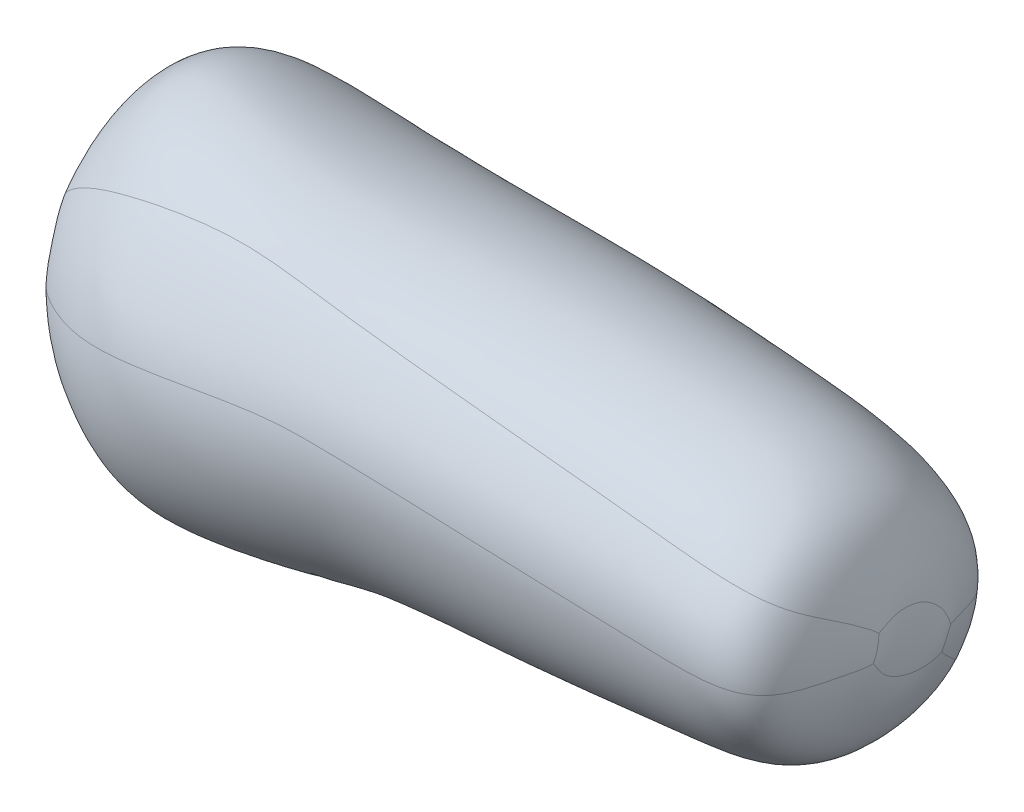
ISO-10303-21;
HEADER;
FILE_DESCRIPTION(('STEP AP214'),'2;1');
FILE_NAME('part.step','',(''),(''),'','','');
FILE_SCHEMA(('AUTOMOTIVE_DESIGN { 1 0 10303 214 1 1 1 1 }'));
ENDSEC;
DATA;
#1=APPLICATION_CONTEXT('core data for automotive mechanical design processes');
#2=APPLICATION_PROTOCOL_DEFINITION('international standard','automotive_design',2000,#1);
#3=PRODUCT_CONTEXT('',#1,'mechanical');
#4=PRODUCT('Part','Part','',(#3));
#5=PRODUCT_RELATED_PRODUCT_CATEGORY('part','',(#4));
#6=PRODUCT_DEFINITION_FORMATION('','',#4);
#7=PRODUCT_DEFINITION_CONTEXT('part definition',#1,'design');
#8=PRODUCT_DEFINITION('design','',#6,#7);
#9=PRODUCT_DEFINITION_SHAPE('','',#8);
#10=(LENGTH_UNIT() NAMED_UNIT(*) SI_UNIT(.MILLI.,.METRE.));
#11=(NAMED_UNIT(*) PLANE_ANGLE_UNIT() SI_UNIT($,.RADIAN.));
#12=(NAMED_UNIT(*) SI_UNIT($,.STERADIAN.) SOLID_ANGLE_UNIT());
#13=UNCERTAINTY_MEASURE_WITH_UNIT(LENGTH_MEASURE(1.E-05),#10,'distance_accuracy_value','');
#14=(GEOMETRIC_REPRESENTATION_CONTEXT(3) GLOBAL_UNCERTAINTY_ASSIGNED_CONTEXT((#13)) GLOBAL_UNIT_ASSIGNED_CONTEXT((#10,
#11,#12)) REPRESENTATION_CONTEXT('',''));
#15=CARTESIAN_POINT('',(0.,0.,0.));
#16=DIRECTION('',(0.,0.,1.));
#17=DIRECTION('',(1.,0.,0.));
#18=AXIS2_PLACEMENT_3D('',#15,#16,#17);
#19=CARTESIAN_POINT('',(701.316047322813,1293.10941921078,-66.2995340034176));
#20=CARTESIAN_POINT('',(701.628375069877,1293.05524359598,-65.9005244747878));
#21=CARTESIAN_POINT('',(703.004654212534,1293.39927603994,-64.8375145417086));
#22=CARTESIAN_POINT('',(706.461888959536,1294.08887285057,-63.359893291705));
#23=CARTESIAN_POINT('',(712.846286632086,1294.47587337821,-64.5137822013995));
#24=CARTESIAN_POINT('',(715.279997034956,1294.04076977927,-64.9688239503356));
#25=CARTESIAN_POINT('',(719.258582003739,1293.43763332773,-65.4507083814109));
#26=CARTESIAN_POINT('',(723.565529320816,1292.80851572084,-65.8782055415214));
#27=CARTESIAN_POINT('',(728.772514788473,1292.22174258743,-66.3144557366205));
#28=CARTESIAN_POINT('',(732.617700847715,1291.85217458737,-66.5115836179016));
#29=CARTESIAN_POINT('',(734.023358130966,1291.51382589544,-67.8653354286268));
#30=CARTESIAN_POINT('',(734.498262195295,1291.38660033271,-70.3148640784867));
#31=CARTESIAN_POINT('',(734.711410390191,1291.30981852722,-71.5943033904152));
#32=CARTESIAN_POINT('',(734.731732336491,1291.35433353155,-71.8669933657349));
#33=CARTESIAN_POINT('',(701.259255735179,1292.62990301695,-66.3707951001111));
#34=CARTESIAN_POINT('',(701.827119641701,1292.0420355935,-65.644037139534));
#35=CARTESIAN_POINT('',(703.292285350916,1292.16195812148,-64.4913578769576));
#36=CARTESIAN_POINT('',(706.897075422676,1292.41907420662,-62.9042236317445));
#37=CARTESIAN_POINT('',(713.665892375407,1292.76976100306,-64.1806358583534));
#38=CARTESIAN_POINT('',(715.725178177384,1292.48207046717,-64.7177099038571));
#39=CARTESIAN_POINT('',(719.636631798372,1291.94514337862,-65.2690462132922));
#40=CARTESIAN_POINT('',(723.941852341893,1291.36758178835,-65.7589210590058));
#41=CARTESIAN_POINT('',(729.039831392803,1290.89276562859,-66.2708377503614));
#42=CARTESIAN_POINT('',(732.698781205905,1290.62353390091,-66.5205176199941));
#43=CARTESIAN_POINT('',(734.058830346766,1290.50678166356,-67.8572636315515));
#44=CARTESIAN_POINT('',(734.518550598516,1290.71699204448,-70.3030248192588));
#45=CARTESIAN_POINT('',(734.725525244751,1290.86547032544,-71.5865390529775));
#46=CARTESIAN_POINT('',(734.748950736922,1291.15441693284,-71.9994561846759));
#47=CARTESIAN_POINT('',(701.217433846265,1291.00794117708,-66.9774237195859));
#48=CARTESIAN_POINT('',(701.932560626555,1289.93133186994,-65.9495524807614));
#49=CARTESIAN_POINT('',(703.537732312885,1289.64923253332,-64.744448560907));
#50=CARTESIAN_POINT('',(707.217535480883,1288.94034807147,-63.1122517327174));
#51=CARTESIAN_POINT('',(714.416803014483,1289.30343785426,-64.6439586450226));
#52=CARTESIAN_POINT('',(716.129826742475,1289.20819993911,-65.3028197046556));
#53=CARTESIAN_POINT('',(720.034545659437,1288.78727199217,-65.8914656311001));
#54=CARTESIAN_POINT('',(724.327499021013,1288.37707406517,-66.4468206827532));
#55=CARTESIAN_POINT('',(729.214927927626,1288.20736843737,-67.097242979649));
#56=CARTESIAN_POINT('',(732.504746402233,1288.17755932957,-67.4536917425621));
#57=CARTESIAN_POINT('',(733.916115971559,1288.50114028648,-68.6081812401705));
#58=CARTESIAN_POINT('',(734.419821849101,1289.37404877544,-70.7590310968912));
#59=CARTESIAN_POINT('',(734.663820860502,1289.97447559184,-71.8882664481783));
#60=CARTESIAN_POINT('',(734.683518366494,1290.54913732328,-72.3229432757716));
#61=CARTESIAN_POINT('',(700.711562382679,1288.90390367207,-69.2982898536545));
#62=CARTESIAN_POINT('',(701.397837354396,1287.50797716701,-68.2180747192761));
#63=CARTESIAN_POINT('',(703.001170722065,1286.3887802007,-67.3410101880647));
#64=CARTESIAN_POINT('',(706.122744906362,1284.77172008237,-66.4204945695941));
#65=CARTESIAN_POINT('',(713.095334286588,1285.10866872061,-68.185653819326));
#66=CARTESIAN_POINT('',(715.040312309835,1285.16319434076,-69.0319276659225));
#67=CARTESIAN_POINT('',(719.120917330961,1285.02923804533,-69.657030494131));
#68=CARTESIAN_POINT('',(723.188938125771,1285.02095039132,-70.2700630925516));
#69=CARTESIAN_POINT('',(728.134161108166,1285.31455696608,-70.9897400119195));
#70=CARTESIAN_POINT('',(731.519403244556,1285.53219101426,-71.3638823361506));
#71=CARTESIAN_POINT('',(733.373103594173,1286.36522664301,-71.7983065614848));
#72=CARTESIAN_POINT('',(734.079163073261,1288.03569825908,-72.6868762537284));
#73=CARTESIAN_POINT('',(734.442810244,1289.09349955937,-73.1627885490672));
#74=CARTESIAN_POINT('',(734.491366376883,1289.86779395194,-73.5023321015218));
#75=CARTESIAN_POINT('',(699.966824427066,1287.44694996935,-72.1551799001469));
#76=CARTESIAN_POINT('',(700.490072714746,1286.16954016179,-71.3682281683685));
#77=CARTESIAN_POINT('',(701.801480776531,1284.91272074569,-71.3679924484858));
#78=CARTESIAN_POINT('',(704.389630301921,1282.86287321511,-71.8095493939357));
#79=CARTESIAN_POINT('',(710.68250012923,1283.35699150195,-73.0312985020033));
#80=CARTESIAN_POINT('',(713.04179974319,1283.77797326539,-73.795016067466));
#81=CARTESIAN_POINT('',(717.221227660212,1284.07032516353,-74.5717114168425));
#82=CARTESIAN_POINT('',(721.300983945706,1284.25715869714,-75.1360570132225));
#83=CARTESIAN_POINT('',(726.525780472067,1284.60542166769,-75.7598008417133));
#84=CARTESIAN_POINT('',(730.35325629381,1284.84973433872,-76.0872528879336));
#85=CARTESIAN_POINT('',(732.811110866279,1285.83076135379,-75.656554945327));
#86=CARTESIAN_POINT('',(733.754518767004,1287.73581698468,-74.9986032647776));
#87=CARTESIAN_POINT('',(734.225929610374,1288.89215570677,-74.685548685412));
#88=CARTESIAN_POINT('',(734.321549406488,1289.55537234832,-74.799320176404));
#89=CARTESIAN_POINT('',(699.589062822472,1287.35916704503,-74.0647320909871));
#90=CARTESIAN_POINT('',(699.978676052797,1286.5011024051,-73.6741307320686));
#91=CARTESIAN_POINT('',(701.079158136645,1285.42642101254,-74.0695352212871));
#92=CARTESIAN_POINT('',(703.437725662844,1283.70137442679,-75.292432197001));
#93=CARTESIAN_POINT('',(709.254503291654,1284.1601596992,-76.2320508448351));
#94=CARTESIAN_POINT('',(712.155483311619,1284.81566364456,-76.6765916195606));
#95=CARTESIAN_POINT('',(716.407399869477,1285.21552673599,-77.2397749705928));
#96=CARTESIAN_POINT('',(720.574530017136,1285.37869486075,-77.6906836200936));
#97=CARTESIAN_POINT('',(725.852702607467,1285.61890889373,-78.1032483104524));
#98=CARTESIAN_POINT('',(729.901650715304,1285.72399578218,-78.3198554667944));
#99=CARTESIAN_POINT('',(732.651407851774,1286.55658730273,-77.5022331215796));
#100=CARTESIAN_POINT('',(733.664324924923,1288.24184395464,-76.1748932615678));
#101=CARTESIAN_POINT('',(734.162806307429,1289.22482504289,-75.4595622927422));
#102=CARTESIAN_POINT('',(734.274146545173,1289.68884892048,-75.3963146222923));
#103=CARTESIAN_POINT('',(699.575300539069,1287.43695486073,-74.5789017781467));
#104=CARTESIAN_POINT('',(699.763226012525,1287.04681644862,-74.6406859422781));
#105=CARTESIAN_POINT('',(700.783856708166,1286.13833860547,-75.2336949805228));
#106=CARTESIAN_POINT('',(703.056662423697,1284.60290293726,-76.7533746816148));
#107=CARTESIAN_POINT('',(708.620617525464,1285.02494119203,-77.5812249890847));
#108=CARTESIAN_POINT('',(711.795991175698,1285.7023284533,-77.8881669826896));
#109=CARTESIAN_POINT('',(716.071212425513,1286.09919866164,-78.3354041403772));
#110=CARTESIAN_POINT('',(720.275619983484,1286.24187899084,-78.7043189284949));
#111=CARTESIAN_POINT('',(725.587003202007,1286.41942230553,-79.0023280774006));
#112=CARTESIAN_POINT('',(729.716155581644,1286.46122872036,-79.1495877097558));
#113=CARTESIAN_POINT('',(732.586180328683,1287.16325003373,-78.1951603257342));
#114=CARTESIAN_POINT('',(733.623962589683,1288.65232363435,-76.6260835275844));
#115=CARTESIAN_POINT('',(734.135218387148,1289.49621797451,-75.757011643321));
#116=CARTESIAN_POINT('',(734.218641185738,1289.7151029157,-75.6156967461615));
#117=(BOUNDED_SURFACE() B_SPLINE_SURFACE(3,3,((#19,#20,#21,#22,#23,#24,#25,#26,#27,#28,#29,#30,
#31,#32),(#33,#34,#35,#36,#37,#38,#39,#40,#41,#42,#43,#44,#45,#46),(#47,#48,#49,#50,#51,#52,#53,
#54,#55,#56,#57,#58,#59,#60),(#61,#62,#63,#64,#65,#66,#67,#68,#69,#70,#71,#72,#73,#74),(#75,#76,
#77,#78,#79,#80,#81,#82,#83,#84,#85,#86,#87,#88),(#89,#90,#91,#92,#93,#94,#95,#96,#97,#98,#99,
#100,#101,#102),(#103,#104,#105,#106,#107,#108,#109,#110,#111,#112,#113,#114,#115,#116)),
.UNSPECIFIED.,.F.,.F.,.F.) B_SPLINE_SURFACE_WITH_KNOTS((4,1,1,1,4),(4,1,1,1,1,1,1,1,1,1,1,4),
(0.,1.,2.,3.,4.),(0.,1.,2.,3.,4.,5.,6.,7.,8.,9.,10.,11.),
.UNSPECIFIED.) GEOMETRIC_REPRESENTATION_ITEM() RATIONAL_B_SPLINE_SURFACE(((0.75,1.,1.,1.,1.,1.,
1.,1.,1.,1.,1.,1.,1.,0.75),(1.,1.,1.,1.,1.,1.,1.,1.,1.,1.,1.,1.,1.,1.),(1.,1.,1.,1.,1.,1.,1.,1.,
1.,1.,1.,1.,1.,1.),(1.,1.,1.,1.,1.,1.,1.,1.,1.,1.,1.,1.,1.,1.),(1.,1.,1.,1.,1.,1.,1.,1.,1.,1.,
1.,1.,1.,1.),(1.,1.,1.,1.,1.,1.,1.,1.,1.,1.,1.,1.,1.,1.),(0.75,1.,1.,1.,1.,1.,1.,1.,1.,1.,1.,1.,
1.,0.75))) REPRESENTATION_ITEM('') SURFACE());
#118=CARTESIAN_POINT('',(701.316047322813,1293.10941921078,-66.2995340034176));
#119=CARTESIAN_POINT('',(701.259255735179,1292.62990301695,-66.3707951001111));
#120=CARTESIAN_POINT('',(701.217433846265,1291.00794117708,-66.9774237195859));
#121=CARTESIAN_POINT('',(700.711562382679,1288.90390367207,-69.2982898536545));
#122=CARTESIAN_POINT('',(699.966824427066,1287.44694996935,-72.1551799001469));
#123=CARTESIAN_POINT('',(699.589062822472,1287.35916704503,-74.0647320909871));
#124=CARTESIAN_POINT('',(699.575300539069,1287.43695486073,-74.5789017781467));
#125=(BOUNDED_CURVE() B_SPLINE_CURVE(3,(#118,#119,#120,#121,#122,#123,#124),.UNSPECIFIED.,.F.,
.F.) B_SPLINE_CURVE_WITH_KNOTS((4,1,1,1,4),(0.,1.,2.,3.,4.),
.UNSPECIFIED.) CURVE() GEOMETRIC_REPRESENTATION_ITEM() RATIONAL_B_SPLINE_CURVE((0.75,1.,1.,1.,
1.,1.,0.75)) REPRESENTATION_ITEM(''));
#126=CARTESIAN_POINT('',(699.575300539069,1287.43695486073,-74.5789017781467));
#127=VERTEX_POINT('',#126);
#128=CARTESIAN_POINT('',(701.316047322813,1293.10941921078,-66.2995340034177));
#129=VERTEX_POINT('',#128);
#130=EDGE_CURVE('E73',#127,#129,#125,.F.);
#131=CARTESIAN_POINT('',(699.575300539069,1287.43695486073,-74.5789017781467));
#132=CARTESIAN_POINT('',(699.763226012525,1287.04681644862,-74.6406859422781));
#133=CARTESIAN_POINT('',(700.783856708166,1286.13833860547,-75.2336949805228));
#134=CARTESIAN_POINT('',(703.056662423697,1284.60290293726,-76.7533746816148));
#135=CARTESIAN_POINT('',(708.620617525464,1285.02494119203,-77.5812249890847));
#136=CARTESIAN_POINT('',(711.795991175698,1285.7023284533,-77.8881669826896));
#137=CARTESIAN_POINT('',(716.071212425513,1286.09919866164,-78.3354041403772));
#138=CARTESIAN_POINT('',(720.275619983484,1286.24187899084,-78.7043189284949));
#139=CARTESIAN_POINT('',(725.587003202007,1286.41942230553,-79.0023280774006));
#140=CARTESIAN_POINT('',(729.716155581644,1286.46122872036,-79.1495877097558));
#141=CARTESIAN_POINT('',(732.586180328683,1287.16325003373,-78.1951603257342));
#142=CARTESIAN_POINT('',(733.623962589683,1288.65232363435,-76.6260835275844));
#143=CARTESIAN_POINT('',(734.135218387148,1289.49621797451,-75.757011643321));
#144=CARTESIAN_POINT('',(734.218641185738,1289.7151029157,-75.6156967461615));
#145=(BOUNDED_CURVE() B_SPLINE_CURVE(3,(#131,#132,#133,#134,#135,#136,#137,#138,#139,#140,#141,
#142,#143,#144),.UNSPECIFIED.,.F.,.F.) B_SPLINE_CURVE_WITH_KNOTS((4,1,1,1,1,1,1,1,1,1,1,4),(0.,
1.,2.,3.,4.,5.,6.,7.,8.,9.,10.,11.),
.UNSPECIFIED.) CURVE() GEOMETRIC_REPRESENTATION_ITEM() RATIONAL_B_SPLINE_CURVE((0.75,1.,1.,1.,
1.,1.,1.,1.,1.,1.,1.,1.,1.,0.75)) REPRESENTATION_ITEM(''));
#146=CARTESIAN_POINT('',(734.218641185738,1289.7151029157,-75.6156967461615));
#147=VERTEX_POINT('',#146);
#148=EDGE_CURVE('E75',#147,#127,#145,.F.);
#149=CARTESIAN_POINT('',(734.218641185738,1289.7151029157,-75.6156967461615));
#150=CARTESIAN_POINT('',(734.274146545173,1289.68884892048,-75.3963146222923));
#151=CARTESIAN_POINT('',(734.321549406488,1289.55537234832,-74.799320176404));
#152=CARTESIAN_POINT('',(734.491366376883,1289.86779395194,-73.5023321015218));
#153=CARTESIAN_POINT('',(734.683518366494,1290.54913732328,-72.3229432757716));
#154=CARTESIAN_POINT('',(734.748950736922,1291.15441693284,-71.9994561846759));
#155=CARTESIAN_POINT('',(734.731732336491,1291.35433353155,-71.8669933657349));
#156=(BOUNDED_CURVE() B_SPLINE_CURVE(3,(#149,#150,#151,#152,#153,#154,#155),.UNSPECIFIED.,.F.,
.F.) B_SPLINE_CURVE_WITH_KNOTS((4,1,1,1,4),(0.,1.,2.,3.,4.),
.UNSPECIFIED.) CURVE() GEOMETRIC_REPRESENTATION_ITEM() RATIONAL_B_SPLINE_CURVE((0.75,1.,1.,1.,
1.,1.,0.75)) REPRESENTATION_ITEM(''));
#157=CARTESIAN_POINT('',(734.731732336492,1291.35433353155,-71.8669933657348));
#158=VERTEX_POINT('',#157);
#159=EDGE_CURVE('E91',#158,#147,#156,.F.);
#160=CARTESIAN_POINT('',(701.316047322813,1293.10941921078,-66.2995340034176));
#161=CARTESIAN_POINT('',(701.628375069877,1293.05524359598,-65.9005244747878));
#162=CARTESIAN_POINT('',(703.004654212534,1293.39927603994,-64.8375145417086));
#163=CARTESIAN_POINT('',(706.461888959536,1294.08887285057,-63.359893291705));
#164=CARTESIAN_POINT('',(712.846286632086,1294.47587337821,-64.5137822013995));
#165=CARTESIAN_POINT('',(715.279997034956,1294.04076977927,-64.9688239503356));
#166=CARTESIAN_POINT('',(719.258582003739,1293.43763332773,-65.4507083814109));
#167=CARTESIAN_POINT('',(723.565529320816,1292.80851572084,-65.8782055415214));
#168=CARTESIAN_POINT('',(728.772514788473,1292.22174258743,-66.3144557366205));
#169=CARTESIAN_POINT('',(732.617700847715,1291.85217458737,-66.5115836179016));
#170=CARTESIAN_POINT('',(734.023358130966,1291.51382589544,-67.8653354286268));
#171=CARTESIAN_POINT('',(734.498262195295,1291.38660033271,-70.3148640784867));
#172=CARTESIAN_POINT('',(734.711410390191,1291.30981852722,-71.5943033904152));
#173=CARTESIAN_POINT('',(734.731732336491,1291.35433353155,-71.8669933657349));
#174=(BOUNDED_CURVE() B_SPLINE_CURVE(3,(#160,#161,#162,#163,#164,#165,#166,#167,#168,#169,#170,
#171,#172,#173),.UNSPECIFIED.,.F.,.F.) B_SPLINE_CURVE_WITH_KNOTS((4,1,1,1,1,1,1,1,1,1,1,4),(0.,
1.,2.,3.,4.,5.,6.,7.,8.,9.,10.,11.),
.UNSPECIFIED.) CURVE() GEOMETRIC_REPRESENTATION_ITEM() RATIONAL_B_SPLINE_CURVE((0.75,1.,1.,1.,
1.,1.,1.,1.,1.,1.,1.,1.,1.,0.75)) REPRESENTATION_ITEM(''));
#175=EDGE_CURVE('E78',#129,#158,#174,.T.);
#176=ORIENTED_EDGE('',*,*,#130,.F.);
#177=ORIENTED_EDGE('',*,*,#148,.F.);
#178=ORIENTED_EDGE('',*,*,#159,.F.);
#179=ORIENTED_EDGE('',*,*,#175,.F.);
#180=EDGE_LOOP('',(#176,#177,#178,#179));
#181=FACE_BOUND('',#180,.T.);
#182=ADVANCED_FACE('F33',(#181),#117,.T.);
#183=CARTESIAN_POINT('',(701.316047322813,1293.10941921078,-66.2995340034176));
#184=CARTESIAN_POINT('',(701.259255735179,1292.62990301695,-66.3707951001111));
#185=CARTESIAN_POINT('',(701.217433846265,1291.00794117708,-66.9774237195859));
#186=CARTESIAN_POINT('',(700.711562382679,1288.90390367207,-69.2982898536545));
#187=CARTESIAN_POINT('',(699.966824427066,1287.44694996935,-72.1551799001469));
#188=CARTESIAN_POINT('',(699.589062822472,1287.35916704503,-74.0647320909871));
#189=CARTESIAN_POINT('',(699.575300539069,1287.43695486073,-74.5789017781467));
#190=CARTESIAN_POINT('',(701.060511163374,1293.64311101943,-66.6272824353757));
#191=CARTESIAN_POINT('',(700.691391828677,1293.21777044039,-67.0975530606882));
#192=CARTESIAN_POINT('',(700.502307065965,1292.08455048421,-68.0052949584323));
#193=CARTESIAN_POINT('',(700.025287410953,1290.29983017713,-70.378504988033));
#194=CARTESIAN_POINT('',(699.443576139394,1288.72435977689,-72.942131631936));
#195=CARTESIAN_POINT('',(699.199449592156,1288.21723168495,-74.4553334498838));
#196=CARTESIAN_POINT('',(699.37361278221,1287.90488108854,-75.0312873011857));
#197=CARTESIAN_POINT('',(700.686554358567,1294.74649114645,-67.3987367508559));
#198=CARTESIAN_POINT('',(700.28824687025,1294.45346655128,-67.9747293505707));
#199=CARTESIAN_POINT('',(699.874639348512,1294.09671943018,-69.4584854761762));
#200=CARTESIAN_POINT('',(699.454404151346,1292.5320847041,-72.1004029912005));
#201=CARTESIAN_POINT('',(699.052783594935,1290.65076968393,-74.5159172355731));
#202=CARTESIAN_POINT('',(698.970464173452,1289.39602026852,-75.4342384123298));
#203=CARTESIAN_POINT('',(699.17151919808,1288.95709886301,-75.9108193516985));
#204=CARTESIAN_POINT('',(700.585719963169,1295.27919928797,-67.8171655888831));
#205=CARTESIAN_POINT('',(700.336149021297,1295.39904106114,-68.3143763077651));
#206=CARTESIAN_POINT('',(699.773303237091,1295.55470318681,-70.2218011432541));
#207=CARTESIAN_POINT('',(699.354615731921,1294.0811206829,-73.2497964015374));
#208=CARTESIAN_POINT('',(699.038846430719,1291.82826284834,-75.6858932186733));
#209=CARTESIAN_POINT('',(699.055174455529,1290.01357761067,-76.2489505496653));
#210=CARTESIAN_POINT('',(699.160974377915,1289.51511089294,-76.2951004634624));
#211=(BOUNDED_SURFACE() B_SPLINE_SURFACE(3,3,((#183,#184,#185,#186,#187,#188,#189),(#190,#191,
#192,#193,#194,#195,#196),(#197,#198,#199,#200,#201,#202,#203),(#204,#205,#206,#207,#208,#209,
#210)),.UNSPECIFIED.,.F.,.F.,.F.) B_SPLINE_SURFACE_WITH_KNOTS((4,4),(4,1,1,1,4),(0.,1.),(0.,1.,
2.,3.,4.),.UNSPECIFIED.) GEOMETRIC_REPRESENTATION_ITEM() RATIONAL_B_SPLINE_SURFACE(((0.75,1.,1.,
1.,1.,1.,0.75),(1.,1.,1.,1.,1.,1.,1.),(1.,1.,1.,1.,1.,1.,1.),(0.75,1.,1.,1.,1.,1.,0.75))) REPRESENTATION_ITEM('') SURFACE());
#212=CARTESIAN_POINT('',(701.316047322813,1293.10941921078,-66.2995340034176));
#213=CARTESIAN_POINT('',(701.060511163374,1293.64311101943,-66.6272824353757));
#214=CARTESIAN_POINT('',(700.686554358567,1294.74649114645,-67.3987367508559));
#215=CARTESIAN_POINT('',(700.585719963169,1295.27919928797,-67.8171655888831));
#216=(BOUNDED_CURVE() B_SPLINE_CURVE(3,(#212,#213,#214,#215),.UNSPECIFIED.,.F.,
.F.) B_SPLINE_CURVE_WITH_KNOTS((4,4),(0.,1.),
.UNSPECIFIED.) CURVE() GEOMETRIC_REPRESENTATION_ITEM() RATIONAL_B_SPLINE_CURVE((0.75,1.,1.,0.75)) REPRESENTATION_ITEM(''));
#217=CARTESIAN_POINT('',(700.585719963169,1295.27919928797,-67.8171655888831));
#218=VERTEX_POINT('',#217);
#219=EDGE_CURVE('E104',#218,#129,#216,.F.);
#220=CARTESIAN_POINT('',(700.585719963169,1295.27919928797,-67.8171655888831));
#221=CARTESIAN_POINT('',(700.336149021297,1295.39904106114,-68.3143763077651));
#222=CARTESIAN_POINT('',(699.773303237091,1295.55470318681,-70.2218011432541));
#223=CARTESIAN_POINT('',(699.354615731921,1294.0811206829,-73.2497964015374));
#224=CARTESIAN_POINT('',(699.038846430719,1291.82826284834,-75.6858932186733));
#225=CARTESIAN_POINT('',(699.055174455529,1290.01357761067,-76.2489505496653));
#226=CARTESIAN_POINT('',(699.160974377915,1289.51511089294,-76.2951004634624));
#227=(BOUNDED_CURVE() B_SPLINE_CURVE(3,(#220,#221,#222,#223,#224,#225,#226),.UNSPECIFIED.,.F.,
.F.) B_SPLINE_CURVE_WITH_KNOTS((4,1,1,1,4),(0.,1.,2.,3.,4.),
.UNSPECIFIED.) CURVE() GEOMETRIC_REPRESENTATION_ITEM() RATIONAL_B_SPLINE_CURVE((0.75,1.,1.,1.,
1.,1.,0.75)) REPRESENTATION_ITEM(''));
#228=CARTESIAN_POINT('',(699.160974377915,1289.51511089294,-76.2951004634624));
#229=VERTEX_POINT('',#228);
#230=EDGE_CURVE('E54',#229,#218,#227,.F.);
#231=CARTESIAN_POINT('',(699.160974377915,1289.51511089294,-76.2951004634624));
#232=CARTESIAN_POINT('',(699.17151919808,1288.95709886301,-75.9108193516985));
#233=CARTESIAN_POINT('',(699.37361278221,1287.90488108854,-75.0312873011857));
#234=CARTESIAN_POINT('',(699.575300539069,1287.43695486073,-74.5789017781467));
#235=(BOUNDED_CURVE() B_SPLINE_CURVE(3,(#231,#232,#233,#234),.UNSPECIFIED.,.F.,
.F.) B_SPLINE_CURVE_WITH_KNOTS((4,4),(0.,1.),
.UNSPECIFIED.) CURVE() GEOMETRIC_REPRESENTATION_ITEM() RATIONAL_B_SPLINE_CURVE((0.75,1.,1.,0.75)) REPRESENTATION_ITEM(''));
#236=EDGE_CURVE('E80',#127,#229,#235,.F.);
#237=ORIENTED_EDGE('',*,*,#219,.F.);
#238=ORIENTED_EDGE('',*,*,#230,.F.);
#239=ORIENTED_EDGE('',*,*,#236,.F.);
#240=ORIENTED_EDGE('',*,*,#130,.T.);
#241=EDGE_LOOP('',(#237,#238,#239,#240));
#242=FACE_BOUND('',#241,.T.);
#243=ADVANCED_FACE('F82',(#242),#211,.T.);
#244=CARTESIAN_POINT('',(699.160974377915,1289.51511089294,-76.2951004634624));
#245=CARTESIAN_POINT('',(699.17151919808,1288.95709886301,-75.9108193516985));
#246=CARTESIAN_POINT('',(699.37361278221,1287.90488108854,-75.0312873011857));
#247=CARTESIAN_POINT('',(699.575300539069,1287.43695486073,-74.5789017781467));
#248=CARTESIAN_POINT('',(699.256229480147,1289.57465620516,-76.725531489045));
#249=CARTESIAN_POINT('',(699.372574222697,1288.51817745748,-76.3874002910566));
#250=CARTESIAN_POINT('',(699.547775972263,1287.59253049212,-75.6072411524876));
#251=CARTESIAN_POINT('',(699.763226012525,1287.04681644862,-74.6406859422781));
#252=CARTESIAN_POINT('',(700.097905222993,1289.38051420253,-77.8700520916619));
#253=CARTESIAN_POINT('',(700.25911374266,1288.0172412508,-77.3754028717861));
#254=CARTESIAN_POINT('',(700.488555279686,1286.85025619839,-76.3978547397369));
#255=CARTESIAN_POINT('',(700.783856708166,1286.13833860547,-75.2336949805228));
#256=CARTESIAN_POINT('',(702.194348956441,1288.49077557551,-79.9638073758597));
#257=CARTESIAN_POINT('',(702.389425025797,1286.88823786289,-79.3947607339559));
#258=CARTESIAN_POINT('',(702.675599184559,1285.50443144775,-78.2143171662393));
#259=CARTESIAN_POINT('',(703.056662423697,1284.60290293726,-76.7533746816148));
#260=CARTESIAN_POINT('',(706.986792371322,1288.74593443653,-80.4863481146504));
#261=CARTESIAN_POINT('',(707.432958645655,1287.21770157186,-80.0283712504289));
#262=CARTESIAN_POINT('',(707.986731759263,1285.88972268485,-78.9303991333345));
#263=CARTESIAN_POINT('',(708.620617525464,1285.02494119203,-77.5812249890847));
#264=CARTESIAN_POINT('',(710.917113557164,1289.25738920161,-80.4850240843926));
#265=CARTESIAN_POINT('',(711.160672983751,1287.84347768991,-80.0821052960181));
#266=CARTESIAN_POINT('',(711.436499039785,1286.58899326204,-79.0997423458294));
#267=CARTESIAN_POINT('',(711.795991175698,1285.7023284533,-77.8881669826896));
#268=CARTESIAN_POINT('',(715.24716648076,1289.51282120779,-80.6323406911398));
#269=CARTESIAN_POINT('',(715.469563989021,1288.17761365235,-80.2882598729039));
#270=CARTESIAN_POINT('',(715.735024981567,1286.98287058728,-79.4310333101832));
#271=CARTESIAN_POINT('',(716.071212425513,1286.09919866164,-78.3354041403772));
#272=CARTESIAN_POINT('',(719.552582646551,1289.56788875644,-80.7543613704308));
#273=CARTESIAN_POINT('',(719.74211684677,1288.27066329928,-80.4679115502746));
#274=CARTESIAN_POINT('',(719.976709949823,1287.10506312092,-79.7179542368963));
#275=CARTESIAN_POINT('',(720.275619983484,1286.24187899084,-78.7043189284949));
#276=CARTESIAN_POINT('',(724.987465641791,1289.53866724578,-80.7288084059622));
#277=CARTESIAN_POINT('',(725.126443917928,1288.31421892783,-80.5278436438703));
#278=CARTESIAN_POINT('',(725.321303796538,1287.2199357173,-79.9014078443489));
#279=CARTESIAN_POINT('',(725.587003202007,1286.41942230553,-79.0023280774006));
#280=CARTESIAN_POINT('',(729.310798833537,1289.40937883044,-80.6644350083194));
#281=CARTESIAN_POINT('',(729.38547296992,1288.23579681319,-80.5224831492042));
#282=CARTESIAN_POINT('',(729.530660447984,1287.19846165855,-79.9793199527172));
#283=CARTESIAN_POINT('',(729.716155581644,1286.46122872036,-79.1495877097558));
#284=CARTESIAN_POINT('',(732.445853971929,1289.57934965784,-79.4833842663311));
#285=CARTESIAN_POINT('',(732.470349266682,1288.62032525225,-79.3511028500821));
#286=CARTESIAN_POINT('',(732.520952805602,1287.76991276473,-78.8880875298886));
#287=CARTESIAN_POINT('',(732.586180328683,1287.16325003373,-78.1951603257342));
#288=CARTESIAN_POINT('',(733.52587802295,1290.26293267685,-77.4911500951268));
#289=CARTESIAN_POINT('',(733.547972504984,1289.63074918847,-77.3915093272606));
#290=CARTESIAN_POINT('',(733.583600254435,1289.06280331403,-77.0772737936009));
#291=CARTESIAN_POINT('',(733.623962589683,1288.65232363435,-76.6260835275844));
#292=CARTESIAN_POINT('',(734.07009417951,1290.56321281826,-76.3281106691712));
#293=CARTESIAN_POINT('',(734.084016277778,1290.14406210131,-76.2623528914251));
#294=CARTESIAN_POINT('',(734.107630466868,1289.76761090613,-76.0544609939216));
#295=CARTESIAN_POINT('',(734.135218387148,1289.49621797451,-75.757011643321));
#296=CARTESIAN_POINT('',(734.166371642077,1290.57195188189,-76.0734861445677));
#297=CARTESIAN_POINT('',(734.221471422476,1290.36674605524,-75.9132949933984));
#298=CARTESIAN_POINT('',(734.246558624892,1289.96024185211,-75.693763972882));
#299=CARTESIAN_POINT('',(734.218641185738,1289.7151029157,-75.6156967461615));
#300=(BOUNDED_SURFACE() B_SPLINE_SURFACE(3,3,((#244,#245,#246,#247),(#248,#249,#250,#251),(#252,
#253,#254,#255),(#256,#257,#258,#259),(#260,#261,#262,#263),(#264,#265,#266,#267),(#268,#269,
#270,#271),(#272,#273,#274,#275),(#276,#277,#278,#279),(#280,#281,#282,#283),(#284,#285,#286,
#287),(#288,#289,#290,#291),(#292,#293,#294,#295),(#296,#297,#298,#299)),.UNSPECIFIED.,.F.,.F.,
.F.) B_SPLINE_SURFACE_WITH_KNOTS((4,1,1,1,1,1,1,1,1,1,1,4),(4,4),(0.,1.,2.,3.,4.,5.,6.,7.,8.,9.,
10.,11.),(0.,1.),
.UNSPECIFIED.) GEOMETRIC_REPRESENTATION_ITEM() RATIONAL_B_SPLINE_SURFACE(((0.75,1.,1.,0.75),(1.,
1.,1.,1.),(1.,1.,1.,1.),(1.,1.,1.,1.),(1.,1.,1.,1.),(1.,1.,1.,1.),(1.,1.,1.,1.),(1.,1.,1.,1.),
(1.,1.,1.,1.),(1.,1.,1.,1.),(1.,1.,1.,1.),(1.,1.,1.,1.),(1.,1.,1.,1.),(0.75,1.,1.,0.75))) REPRESENTATION_ITEM('') SURFACE());
#301=CARTESIAN_POINT('',(699.160974377915,1289.51511089294,-76.2951004634624));
#302=CARTESIAN_POINT('',(699.256229480147,1289.57465620516,-76.725531489045));
#303=CARTESIAN_POINT('',(700.097905222993,1289.38051420253,-77.8700520916619));
#304=CARTESIAN_POINT('',(702.194348956441,1288.49077557551,-79.9638073758597));
#305=CARTESIAN_POINT('',(706.986792371322,1288.74593443653,-80.4863481146504));
#306=CARTESIAN_POINT('',(710.917113557164,1289.25738920161,-80.4850240843926));
#307=CARTESIAN_POINT('',(715.24716648076,1289.51282120779,-80.6323406911398));
#308=CARTESIAN_POINT('',(719.552582646551,1289.56788875644,-80.7543613704308));
#309=CARTESIAN_POINT('',(724.987465641791,1289.53866724578,-80.7288084059622));
#310=CARTESIAN_POINT('',(729.310798833537,1289.40937883044,-80.6644350083194));
#311=CARTESIAN_POINT('',(732.445853971929,1289.57934965784,-79.4833842663311));
#312=CARTESIAN_POINT('',(733.52587802295,1290.26293267685,-77.4911500951268));
#313=CARTESIAN_POINT('',(734.07009417951,1290.56321281826,-76.3281106691712));
#314=CARTESIAN_POINT('',(734.166371642077,1290.57195188189,-76.0734861445677));
#315=(BOUNDED_CURVE() B_SPLINE_CURVE(3,(#301,#302,#303,#304,#305,#306,#307,#308,#309,#310,#311,
#312,#313,#314),.UNSPECIFIED.,.F.,.F.) B_SPLINE_CURVE_WITH_KNOTS((4,1,1,1,1,1,1,1,1,1,1,4),(0.,
1.,2.,3.,4.,5.,6.,7.,8.,9.,10.,11.),
.UNSPECIFIED.) CURVE() GEOMETRIC_REPRESENTATION_ITEM() RATIONAL_B_SPLINE_CURVE((0.75,1.,1.,1.,
1.,1.,1.,1.,1.,1.,1.,1.,1.,0.75)) REPRESENTATION_ITEM(''));
#316=CARTESIAN_POINT('',(734.166371642077,1290.57195188189,-76.0734861445677));
#317=VERTEX_POINT('',#316);
#318=EDGE_CURVE('E123',#317,#229,#315,.F.);
#319=CARTESIAN_POINT('',(734.166371642077,1290.57195188189,-76.0734861445677));
#320=CARTESIAN_POINT('',(734.221471422476,1290.36674605524,-75.9132949933984));
#321=CARTESIAN_POINT('',(734.246558624892,1289.96024185211,-75.693763972882));
#322=CARTESIAN_POINT('',(734.218641185738,1289.7151029157,-75.6156967461615));
#323=(BOUNDED_CURVE() B_SPLINE_CURVE(3,(#319,#320,#321,#322),.UNSPECIFIED.,.F.,
.F.) B_SPLINE_CURVE_WITH_KNOTS((4,4),(0.,1.),
.UNSPECIFIED.) CURVE() GEOMETRIC_REPRESENTATION_ITEM() RATIONAL_B_SPLINE_CURVE((0.75,1.,1.,0.75)) REPRESENTATION_ITEM(''));
#324=EDGE_CURVE('E88',#147,#317,#323,.F.);
#325=ORIENTED_EDGE('',*,*,#318,.F.);
#326=ORIENTED_EDGE('',*,*,#324,.F.);
#327=ORIENTED_EDGE('',*,*,#148,.T.);
#328=ORIENTED_EDGE('',*,*,#236,.T.);
#329=EDGE_LOOP('',(#325,#326,#327,#328));
#330=FACE_BOUND('',#329,.T.);
#331=ADVANCED_FACE('F86',(#330),#300,.T.);
#332=CARTESIAN_POINT('',(734.166371642077,1290.57195188189,-76.0734861445677));
#333=CARTESIAN_POINT('',(734.221471422476,1290.36674605524,-75.9132949933984));
#334=CARTESIAN_POINT('',(734.246558624892,1289.96024185211,-75.693763972882));
#335=CARTESIAN_POINT('',(734.218641185738,1289.7151029157,-75.6156967461615));
#336=CARTESIAN_POINT('',(734.207549324208,1290.78589677217,-75.9790527711445));
#337=CARTESIAN_POINT('',(734.358926567175,1290.58943000914,-75.5642370953717));
#338=CARTESIAN_POINT('',(734.385486782917,1290.15287279807,-75.3330669518425));
#339=CARTESIAN_POINT('',(734.274146545173,1289.68884892048,-75.3963146222923));
#340=CARTESIAN_POINT('',(734.210207719751,1291.43645846227,-75.7691388509977));
#341=CARTESIAN_POINT('',(734.372703373145,1290.96685291191,-75.2971619390898));
#342=CARTESIAN_POINT('',(734.417169202593,1290.21858898987,-74.9130916674069));
#343=CARTESIAN_POINT('',(734.321549406488,1289.55537234832,-74.799320176404));
#344=CARTESIAN_POINT('',(734.278990457906,1292.43146683313,-74.6170146455159));
#345=CARTESIAN_POINT('',(734.45521119012,1291.66177647947,-74.2830066112327));
#346=CARTESIAN_POINT('',(734.539922509746,1290.64208834449,-73.8418756539873));
#347=CARTESIAN_POINT('',(734.491366376883,1289.86779395194,-73.5023321015218));
#348=CARTESIAN_POINT('',(734.47567212287,1292.68133680159,-73.0923698537258));
#349=CARTESIAN_POINT('',(734.6206113788,1291.97290910943,-73.0623560829237));
#350=CARTESIAN_POINT('',(734.703215872506,1291.12379905472,-72.7576201033755));
#351=CARTESIAN_POINT('',(734.683518366494,1290.54913732328,-72.3229432757716));
#352=CARTESIAN_POINT('',(734.606036000677,1292.41865782372,-72.4635733264605));
#353=CARTESIAN_POINT('',(734.715739890307,1291.94701761456,-72.5964504629331));
#354=CARTESIAN_POINT('',(734.772376229092,1291.44336354025,-72.412373316385));
#355=CARTESIAN_POINT('',(734.748950736922,1291.15441693284,-71.9994561846759));
#356=CARTESIAN_POINT('',(734.616761878569,1292.34489380439,-72.2318689177319));
#357=CARTESIAN_POINT('',(734.676976762335,1292.07219169013,-72.1824552816093));
#358=CARTESIAN_POINT('',(734.734835882362,1291.59876513461,-72.0072205221135));
#359=CARTESIAN_POINT('',(734.731732336491,1291.35433353155,-71.8669933657349));
#360=(BOUNDED_SURFACE() B_SPLINE_SURFACE(3,3,((#332,#333,#334,#335),(#336,#337,#338,#339),(#340,
#341,#342,#343),(#344,#345,#346,#347),(#348,#349,#350,#351),(#352,#353,#354,#355),(#356,#357,
#358,#359)),.UNSPECIFIED.,.F.,.F.,.F.) B_SPLINE_SURFACE_WITH_KNOTS((4,1,1,1,4),(4,4),(0.,1.,2.,
3.,4.),(0.,1.),.UNSPECIFIED.) GEOMETRIC_REPRESENTATION_ITEM() RATIONAL_B_SPLINE_SURFACE(((0.75,
1.,1.,0.75),(1.,1.,1.,1.),(1.,1.,1.,1.),(1.,1.,1.,1.),(1.,1.,1.,1.),(1.,1.,1.,1.),(0.75,1.,1.,0.75))) REPRESENTATION_ITEM('') SURFACE());
#361=CARTESIAN_POINT('',(734.616761878569,1292.34489380439,-72.2318689177319));
#362=CARTESIAN_POINT('',(734.606036000677,1292.41865782372,-72.4635733264605));
#363=CARTESIAN_POINT('',(734.47567212287,1292.68133680159,-73.0923698537258));
#364=CARTESIAN_POINT('',(734.278990457906,1292.43146683313,-74.6170146455159));
#365=CARTESIAN_POINT('',(734.210207719751,1291.43645846227,-75.7691388509977));
#366=CARTESIAN_POINT('',(734.207549324208,1290.78589677217,-75.9790527711445));
#367=CARTESIAN_POINT('',(734.166371642077,1290.57195188189,-76.0734861445677));
#368=(BOUNDED_CURVE() B_SPLINE_CURVE(3,(#361,#362,#363,#364,#365,#366,#367),.UNSPECIFIED.,.F.,
.F.) B_SPLINE_CURVE_WITH_KNOTS((4,1,1,1,4),(0.,1.,2.,3.,4.),
.UNSPECIFIED.) CURVE() GEOMETRIC_REPRESENTATION_ITEM() RATIONAL_B_SPLINE_CURVE((0.75,1.,1.,1.,
1.,1.,0.75)) REPRESENTATION_ITEM(''));
#369=CARTESIAN_POINT('',(734.616761878569,1292.34489380439,-72.2318689177319));
#370=VERTEX_POINT('',#369);
#371=EDGE_CURVE('E46',#370,#317,#368,.T.);
#372=CARTESIAN_POINT('',(734.731732336491,1291.35433353155,-71.8669933657349));
#373=CARTESIAN_POINT('',(734.734835882362,1291.59876513461,-72.0072205221135));
#374=CARTESIAN_POINT('',(734.676976762335,1292.07219169013,-72.1824552816093));
#375=CARTESIAN_POINT('',(734.616761878569,1292.34489380439,-72.2318689177319));
#376=(BOUNDED_CURVE() B_SPLINE_CURVE(3,(#372,#373,#374,#375),.UNSPECIFIED.,.F.,
.F.) B_SPLINE_CURVE_WITH_KNOTS((4,4),(0.,1.),
.UNSPECIFIED.) CURVE() GEOMETRIC_REPRESENTATION_ITEM() RATIONAL_B_SPLINE_CURVE((0.75,1.,1.,0.75)) REPRESENTATION_ITEM(''));
#377=EDGE_CURVE('E111',#158,#370,#376,.T.);
#378=ORIENTED_EDGE('',*,*,#371,.F.);
#379=ORIENTED_EDGE('',*,*,#377,.F.);
#380=ORIENTED_EDGE('',*,*,#159,.T.);
#381=ORIENTED_EDGE('',*,*,#324,.T.);
#382=EDGE_LOOP('',(#378,#379,#380,#381));
#383=FACE_BOUND('',#382,.T.);
#384=ADVANCED_FACE('F163',(#383),#360,.T.);
#385=CARTESIAN_POINT('',(701.316047322813,1293.10941921078,-66.2995340034176));
#386=CARTESIAN_POINT('',(701.060511163374,1293.64311101943,-66.6272824353757));
#387=CARTESIAN_POINT('',(700.686554358567,1294.74649114645,-67.3987367508559));
#388=CARTESIAN_POINT('',(700.585719963169,1295.27919928797,-67.8171655888831));
#389=CARTESIAN_POINT('',(701.628375069877,1293.05524359598,-65.9005244747878));
#390=CARTESIAN_POINT('',(701.429630498062,1294.06845159846,-66.1570118100307));
#391=CARTESIAN_POINT('',(701.084861846875,1295.03951574163,-66.822744151152));
#392=CARTESIAN_POINT('',(700.734456509615,1295.69206565632,-67.7383837080503));
#393=CARTESIAN_POINT('',(703.004654212534,1293.39927603994,-64.8375145417086));
#394=CARTESIAN_POINT('',(702.717023074161,1294.6365939584,-65.1836712064596));
#395=CARTESIAN_POINT('',(702.264484278405,1295.85486700124,-66.0025298779199));
#396=CARTESIAN_POINT('',(701.823216985877,1296.75519419498,-67.1303941959408));
#397=CARTESIAN_POINT('',(706.461888959536,1294.08887285057,-63.359893291705));
#398=CARTESIAN_POINT('',(706.026702496388,1295.75867149454,-63.8155629516765));
#399=CARTESIAN_POINT('',(705.316559599193,1297.35890571489,-64.8309163220897));
#400=CARTESIAN_POINT('',(704.634831600447,1298.50180878156,-66.1981211614042));
#401=CARTESIAN_POINT('',(712.846286632086,1294.47587337821,-64.5137822013995));
#402=CARTESIAN_POINT('',(712.026680888765,1296.18198575336,-64.8469285444457));
#403=CARTESIAN_POINT('',(710.762924721675,1297.86104892926,-65.7448826238561));
#404=CARTESIAN_POINT('',(709.68185929538,1298.92728537614,-66.8731237593095));
#405=CARTESIAN_POINT('',(715.279997034956,1294.04076977927,-64.9688239503356));
#406=CARTESIAN_POINT('',(714.834815892519,1295.59946909136,-65.2199379968143));
#407=CARTESIAN_POINT('',(714.146777890196,1297.07993245151,-66.0147209901762));
#408=CARTESIAN_POINT('',(713.487079268366,1298.05686814745,-67.0580964485909));
#409=CARTESIAN_POINT('',(719.258582003739,1293.43763332773,-65.4507083814109));
#410=CARTESIAN_POINT('',(718.880532209088,1294.93012327683,-65.6323705495297));
#411=CARTESIAN_POINT('',(718.323389550332,1296.3361674818,-66.3069045946657));
#412=CARTESIAN_POINT('',(717.774010201228,1297.31405249541,-67.2673989097185));
#413=CARTESIAN_POINT('',(723.565529320816,1292.80851572084,-65.8782055415214));
#414=CARTESIAN_POINT('',(723.189206299739,1294.2494496533,-65.9974900240261));
#415=CARTESIAN_POINT('',(722.629383597128,1295.63606365664,-66.5800088009148));
#416=CARTESIAN_POINT('',(722.07862818821,1296.65267863552,-67.474695271167));
#417=CARTESIAN_POINT('',(728.772514788473,1292.22174258743,-66.3144557366205));
#418=CARTESIAN_POINT('',(728.505198184135,1293.55071954626,-66.3580737228905));
#419=CARTESIAN_POINT('',(728.058113242888,1294.86597486831,-66.8585123100578));
#420=CARTESIAN_POINT('',(727.587287562234,1295.88150124193,-67.6835680557178));
#421=CARTESIAN_POINT('',(732.617700847715,1291.85217458737,-66.5115836179016));
#422=CARTESIAN_POINT('',(732.536620489525,1293.08081527384,-66.5026496158089));
#423=CARTESIAN_POINT('',(732.277442371328,1294.31510936107,-66.9513686729021));
#424=CARTESIAN_POINT('',(731.961063869587,1295.29201916178,-67.743730943117));
#425=CARTESIAN_POINT('',(734.023358130966,1291.51382589544,-67.8653354286268));
#426=CARTESIAN_POINT('',(733.987885915176,1292.52087012733,-67.8734072257021));
#427=CARTESIAN_POINT('',(733.845584295948,1293.53213790254,-68.2650096241298));
#428=CARTESIAN_POINT('',(733.676776156303,1294.33094488955,-68.9369595460183));
#429=CARTESIAN_POINT('',(734.498262195295,1291.38660033271,-70.3148640784867));
#430=CARTESIAN_POINT('',(734.477973792066,1292.05620862095,-70.3267033377038));
#431=CARTESIAN_POINT('',(734.388032610903,1292.7239535629,-70.5783849949814));
#432=CARTESIAN_POINT('',(734.279410920463,1293.24675214191,-71.0047091730134));
#433=CARTESIAN_POINT('',(734.711410390191,1291.30981852722,-71.5943033904152));
#434=CARTESIAN_POINT('',(734.697295535621,1291.75416672897,-71.6020677278313));
#435=CARTESIAN_POINT('',(734.638213634344,1292.19736576571,-71.7684601002856));
#436=CARTESIAN_POINT('',(734.567272872686,1292.5438318993,-72.0495781451477));
#437=CARTESIAN_POINT('',(734.731732336491,1291.35433353155,-71.8669933657349));
#438=CARTESIAN_POINT('',(734.734835882362,1291.59876513461,-72.0072205221135));
#439=CARTESIAN_POINT('',(734.676976762335,1292.07219169013,-72.1824552816093));
#440=CARTESIAN_POINT('',(734.616761878569,1292.34489380439,-72.2318689177319));
#441=(BOUNDED_SURFACE() B_SPLINE_SURFACE(3,3,((#385,#386,#387,#388),(#389,#390,#391,#392),(#393,
#394,#395,#396),(#397,#398,#399,#400),(#401,#402,#403,#404),(#405,#406,#407,#408),(#409,#410,
#411,#412),(#413,#414,#415,#416),(#417,#418,#419,#420),(#421,#422,#423,#424),(#425,#426,#427,
#428),(#429,#430,#431,#432),(#433,#434,#435,#436),(#437,#438,#439,#440)),.UNSPECIFIED.,.F.,.F.,
.F.) B_SPLINE_SURFACE_WITH_KNOTS((4,1,1,1,1,1,1,1,1,1,1,4),(4,4),(0.,1.,2.,3.,4.,5.,6.,7.,8.,9.,
10.,11.),(0.,1.),
.UNSPECIFIED.) GEOMETRIC_REPRESENTATION_ITEM() RATIONAL_B_SPLINE_SURFACE(((0.75,1.,1.,0.75),(1.,
1.,1.,1.),(1.,1.,1.,1.),(1.,1.,1.,1.),(1.,1.,1.,1.),(1.,1.,1.,1.),(1.,1.,1.,1.),(1.,1.,1.,1.),
(1.,1.,1.,1.),(1.,1.,1.,1.),(1.,1.,1.,1.),(1.,1.,1.,1.),(1.,1.,1.,1.),(0.75,1.,1.,0.75))) REPRESENTATION_ITEM('') SURFACE());
#442=CARTESIAN_POINT('',(700.585719963169,1295.27919928797,-67.8171655888831));
#443=CARTESIAN_POINT('',(700.734456509615,1295.69206565632,-67.7383837080503));
#444=CARTESIAN_POINT('',(701.823216985877,1296.75519419498,-67.1303941959408));
#445=CARTESIAN_POINT('',(704.634831600447,1298.50180878156,-66.1981211614042));
#446=CARTESIAN_POINT('',(709.68185929538,1298.92728537614,-66.8731237593095));
#447=CARTESIAN_POINT('',(713.487079268366,1298.05686814745,-67.0580964485909));
#448=CARTESIAN_POINT('',(717.774010201228,1297.31405249541,-67.2673989097185));
#449=CARTESIAN_POINT('',(722.07862818821,1296.65267863552,-67.474695271167));
#450=CARTESIAN_POINT('',(727.587287562234,1295.88150124193,-67.6835680557178));
#451=CARTESIAN_POINT('',(731.961063869587,1295.29201916178,-67.743730943117));
#452=CARTESIAN_POINT('',(733.676776156303,1294.33094488955,-68.9369595460183));
#453=CARTESIAN_POINT('',(734.279410920463,1293.24675214191,-71.0047091730134));
#454=CARTESIAN_POINT('',(734.567272872686,1292.5438318993,-72.0495781451477));
#455=CARTESIAN_POINT('',(734.616761878569,1292.34489380439,-72.2318689177319));
#456=(BOUNDED_CURVE() B_SPLINE_CURVE(3,(#442,#443,#444,#445,#446,#447,#448,#449,#450,#451,#452,
#453,#454,#455),.UNSPECIFIED.,.F.,.F.) B_SPLINE_CURVE_WITH_KNOTS((4,1,1,1,1,1,1,1,1,1,1,4),(0.,
1.,2.,3.,4.,5.,6.,7.,8.,9.,10.,11.),
.UNSPECIFIED.) CURVE() GEOMETRIC_REPRESENTATION_ITEM() RATIONAL_B_SPLINE_CURVE((0.75,1.,1.,1.,
1.,1.,1.,1.,1.,1.,1.,1.,1.,0.75)) REPRESENTATION_ITEM(''));
#457=EDGE_CURVE('E11',#218,#370,#456,.T.);
#458=ORIENTED_EDGE('',*,*,#175,.T.);
#459=ORIENTED_EDGE('',*,*,#377,.T.);
#460=ORIENTED_EDGE('',*,*,#457,.F.);
#461=ORIENTED_EDGE('',*,*,#219,.T.);
#462=EDGE_LOOP('',(#458,#459,#460,#461));
#463=FACE_BOUND('',#462,.T.);
#464=ADVANCED_FACE('F159',(#463),#441,.T.);
#465=CARTESIAN_POINT('',(700.585719963169,1295.27919928797,-67.8171655888831));
#466=CARTESIAN_POINT('',(700.336149021297,1295.39904106114,-68.3143763077651));
#467=CARTESIAN_POINT('',(699.773303237091,1295.55470318681,-70.2218011432541));
#468=CARTESIAN_POINT('',(699.354615731921,1294.0811206829,-73.2497964015374));
#469=CARTESIAN_POINT('',(699.038846430719,1291.82826284834,-75.6858932186733));
#470=CARTESIAN_POINT('',(699.055174455529,1290.01357761067,-76.2489505496653));
#471=CARTESIAN_POINT('',(699.160974377915,1289.51511089294,-76.2951004634624));
#472=CARTESIAN_POINT('',(700.734456509615,1295.69206565632,-67.7383837080503));
#473=CARTESIAN_POINT('',(700.384051172345,1296.34461557102,-68.6540232649486));
#474=CARTESIAN_POINT('',(699.671967125651,1297.01268694345,-70.9851168103214));
#475=CARTESIAN_POINT('',(699.254827312497,1295.6301566617,-74.3991898118634));
#476=CARTESIAN_POINT('',(699.024909266522,1293.00575601275,-76.8558692017951));
#477=CARTESIAN_POINT('',(699.139884737605,1290.63113495283,-77.0636626870117));
#478=CARTESIAN_POINT('',(699.256229480147,1289.57465620516,-76.725531489045));
#479=CARTESIAN_POINT('',(701.823216985877,1296.75519419498,-67.1303941959408));
#480=CARTESIAN_POINT('',(701.381949693368,1297.65552138873,-68.2582585139616));
#481=CARTESIAN_POINT('',(700.521958114835,1298.82028407803,-71.1319984431347));
#482=CARTESIAN_POINT('',(699.997440154015,1297.36179152299,-75.5529674468866));
#483=CARTESIAN_POINT('',(699.750745698626,1293.86290885634,-78.3882019269541));
#484=CARTESIAN_POINT('',(699.936696703308,1290.74378715426,-78.3647013115379));
#485=CARTESIAN_POINT('',(700.097905222993,1289.38051420253,-77.8700520916619));
#486=CARTESIAN_POINT('',(704.634831600447,1298.50180878156,-66.1981211614042));
#487=CARTESIAN_POINT('',(703.953103601692,1299.64471184824,-67.5653260007079));
#488=CARTESIAN_POINT('',(702.646477401069,1301.01585567424,-71.0034386170963));
#489=CARTESIAN_POINT('',(701.898959786569,1298.72647191952,-76.5293504500882));
#490=CARTESIAN_POINT('',(701.791316927156,1293.73585130825,-80.4481534499456));
#491=CARTESIAN_POINT('',(701.999272887076,1290.09331328811,-80.5328540177527));
#492=CARTESIAN_POINT('',(702.194348956441,1288.49077557551,-79.9638073758597));
#493=CARTESIAN_POINT('',(709.68185929538,1298.92728537614,-66.8731237593095));
#494=CARTESIAN_POINT('',(708.600793869076,1299.99352182302,-68.001364894763));
#495=CARTESIAN_POINT('',(706.804044498088,1300.90034125873,-70.7184212777228));
#496=CARTESIAN_POINT('',(705.706199907674,1298.49336060816,-76.3405646066709));
#497=CARTESIAN_POINT('',(705.863507226884,1293.73114098581,-80.5802882016231));
#498=CARTESIAN_POINT('',(706.540626096989,1290.2741673012,-80.9443249788719));
#499=CARTESIAN_POINT('',(706.986792371322,1288.74593443653,-80.4863481146504));
#500=CARTESIAN_POINT('',(713.487079268366,1298.05686814745,-67.0580964485909));
#501=CARTESIAN_POINT('',(712.827380646537,1299.03380384339,-68.1014719070165));
#502=CARTESIAN_POINT('',(711.564662163884,1299.98061990685,-70.6854077539729));
#503=CARTESIAN_POINT('',(710.318413318828,1298.18607626746,-76.3221036435906));
#504=CARTESIAN_POINT('',(710.250968536287,1293.81797790425,-80.5348921257685));
#505=CARTESIAN_POINT('',(710.673554130567,1290.67130071329,-80.8879428727455));
#506=CARTESIAN_POINT('',(710.917113557164,1289.25738920161,-80.4850240843926));
#507=CARTESIAN_POINT('',(717.774010201228,1297.31405249541,-67.2673989097185));
#508=CARTESIAN_POINT('',(717.224630852117,1298.29193750903,-68.2278932247822));
#509=CARTESIAN_POINT('',(716.141398773198,1299.39138915354,-70.7208023947325));
#510=CARTESIAN_POINT('',(714.866290674486,1298.0250886849,-76.4408491285283));
#511=CARTESIAN_POINT('',(714.66610092449,1293.7993728549,-80.6382916568683));
#512=CARTESIAN_POINT('',(715.024768972489,1290.84802876324,-80.976421509376));
#513=CARTESIAN_POINT('',(715.24716648076,1289.51282120779,-80.6323406911398));
#514=CARTESIAN_POINT('',(722.07862818821,1296.65267863552,-67.474695271167));
#515=CARTESIAN_POINT('',(721.52787277931,1297.66929361439,-68.3693817414081));
#516=CARTESIAN_POINT('',(720.444496548878,1298.96252552315,-70.7830900686174));
#517=CARTESIAN_POINT('',(719.329947885837,1297.88625794756,-76.5273474613751));
#518=CARTESIAN_POINT('',(719.074097851549,1293.72281568554,-80.6866958444881));
#519=CARTESIAN_POINT('',(719.363048446332,1290.86511421362,-81.0408111905871));
#520=CARTESIAN_POINT('',(719.552582646551,1289.56788875644,-80.7543613704308));
#521=CARTESIAN_POINT('',(727.587287562234,1295.88150124193,-67.6835680557178));
#522=CARTESIAN_POINT('',(727.116461881562,1296.89702761554,-68.5086238013671));
#523=CARTESIAN_POINT('',(726.127329041385,1298.32862246586,-70.8079696096508));
#524=CARTESIAN_POINT('',(725.048478194216,1297.48881685916,-76.4215312778207));
#525=CARTESIAN_POINT('',(724.682294018292,1293.4723424144,-80.4807606173686));
#526=CARTESIAN_POINT('',(724.848487365643,1290.76311556372,-80.9297731680434));
#527=CARTESIAN_POINT('',(724.987465641791,1289.53866724578,-80.7288084059622));
#528=CARTESIAN_POINT('',(731.961063869587,1295.29201916178,-67.743730943117));
#529=CARTESIAN_POINT('',(731.644685367854,1296.26892896249,-68.5360932133319));
#530=CARTESIAN_POINT('',(730.897527597338,1297.70797999084,-70.8081041799828));
#531=CARTESIAN_POINT('',(729.689611018019,1297.10252038781,-76.3359478506159));
#532=CARTESIAN_POINT('',(729.227803107775,1293.20261860742,-80.2878679108777));
#533=CARTESIAN_POINT('',(729.236124697163,1290.58296084769,-80.8063868674345));
#534=CARTESIAN_POINT('',(729.310798833537,1289.40937883044,-80.6644350083194));
#535=CARTESIAN_POINT('',(733.676776156303,1294.33094488955,-68.9369595460183));
#536=CARTESIAN_POINT('',(733.507968016658,1295.12975187656,-69.608909467896));
#537=CARTESIAN_POINT('',(733.117338696485,1296.30244427413,-71.5135043585408));
#538=CARTESIAN_POINT('',(732.568409745598,1295.8180069245,-76.035729343322));
#539=CARTESIAN_POINT('',(732.424584575967,1292.67364671073,-79.2187607072219));
#540=CARTESIAN_POINT('',(732.421358677167,1290.53837406342,-79.615665682591));
#541=CARTESIAN_POINT('',(732.445853971929,1289.57934965784,-79.4833842663311));
#542=CARTESIAN_POINT('',(734.279410920463,1293.24675214191,-71.0047091730134));
#543=CARTESIAN_POINT('',(734.170789230033,1293.76955072093,-71.4310333510344));
#544=CARTESIAN_POINT('',(733.916184830596,1294.525255153,-72.6329667486182));
#545=CARTESIAN_POINT('',(733.567309436109,1294.24054233147,-75.4047929024084));
#546=CARTESIAN_POINT('',(733.486661111703,1292.2879583699,-77.3608828671385));
#547=CARTESIAN_POINT('',(733.503783540916,1290.89511616522,-77.5907908629931));
#548=CARTESIAN_POINT('',(733.52587802295,1290.26293267685,-77.4911500951268));
#549=CARTESIAN_POINT('',(734.567272872686,1292.5438318993,-72.0495781451477));
#550=CARTESIAN_POINT('',(734.496332111028,1292.89029803288,-72.3306961899989));
#551=CARTESIAN_POINT('',(734.330732866931,1293.38976449375,-73.1223836245279));
#552=CARTESIAN_POINT('',(734.102769725692,1293.2011571868,-74.9510226797882));
#553=CARTESIAN_POINT('',(734.047712066357,1291.90606401262,-76.2411157629056));
#554=CARTESIAN_POINT('',(734.056172081251,1290.98236353522,-76.3938684469173));
#555=CARTESIAN_POINT('',(734.07009417951,1290.56321281826,-76.3281106691712));
#556=CARTESIAN_POINT('',(734.616761878569,1292.34489380439,-72.2318689177319));
#557=CARTESIAN_POINT('',(734.606036000677,1292.41865782372,-72.4635733264605));
#558=CARTESIAN_POINT('',(734.47567212287,1292.68133680159,-73.0923698537258));
#559=CARTESIAN_POINT('',(734.278990457906,1292.43146683313,-74.6170146455159));
#560=CARTESIAN_POINT('',(734.210207719751,1291.43645846227,-75.7691388509977));
#561=CARTESIAN_POINT('',(734.207549324208,1290.78589677217,-75.9790527711445));
#562=CARTESIAN_POINT('',(734.166371642077,1290.57195188189,-76.0734861445677));
#563=(BOUNDED_SURFACE() B_SPLINE_SURFACE(3,3,((#465,#466,#467,#468,#469,#470,#471),(#472,#473,
#474,#475,#476,#477,#478),(#479,#480,#481,#482,#483,#484,#485),(#486,#487,#488,#489,#490,#491,
#492),(#493,#494,#495,#496,#497,#498,#499),(#500,#501,#502,#503,#504,#505,#506),(#507,#508,#509,
#510,#511,#512,#513),(#514,#515,#516,#517,#518,#519,#520),(#521,#522,#523,#524,#525,#526,#527),
(#528,#529,#530,#531,#532,#533,#534),(#535,#536,#537,#538,#539,#540,#541),(#542,#543,#544,#545,
#546,#547,#548),(#549,#550,#551,#552,#553,#554,#555),(#556,#557,#558,#559,#560,#561,#562)),
.UNSPECIFIED.,.F.,.F.,.F.) B_SPLINE_SURFACE_WITH_KNOTS((4,1,1,1,1,1,1,1,1,1,1,4),(4,1,1,1,4),
(0.,1.,2.,3.,4.,5.,6.,7.,8.,9.,10.,11.),(0.,1.,2.,3.,4.),
.UNSPECIFIED.) GEOMETRIC_REPRESENTATION_ITEM() RATIONAL_B_SPLINE_SURFACE(((0.75,1.,1.,1.,1.,1.,
0.75),(1.,1.,1.,1.,1.,1.,1.),(1.,1.,1.,1.,1.,1.,1.),(1.,1.,1.,1.,1.,1.,1.),(1.,1.,1.,1.,1.,1.,
1.),(1.,1.,1.,1.,1.,1.,1.),(1.,1.,1.,1.,1.,1.,1.),(1.,1.,1.,1.,1.,1.,1.),(1.,1.,1.,1.,1.,1.,1.),
(1.,1.,1.,1.,1.,1.,1.),(1.,1.,1.,1.,1.,1.,1.),(1.,1.,1.,1.,1.,1.,1.),(1.,1.,1.,1.,1.,1.,1.),
(0.75,1.,1.,1.,1.,1.,0.75))) REPRESENTATION_ITEM('') SURFACE());
#564=ORIENTED_EDGE('',*,*,#457,.T.);
#565=ORIENTED_EDGE('',*,*,#371,.T.);
#566=ORIENTED_EDGE('',*,*,#318,.T.);
#567=ORIENTED_EDGE('',*,*,#230,.T.);
#568=EDGE_LOOP('',(#564,#565,#566,#567));
#569=FACE_BOUND('',#568,.T.);
#570=ADVANCED_FACE('F35',(#569),#563,.T.);
#571=CLOSED_SHELL('',(#182,#243,#331,#384,#464,#570));
#572=MANIFOLD_SOLID_BREP('B2',#571);
#573=ADVANCED_BREP_SHAPE_REPRESENTATION('',(#18,#572),#14);
#574=SHAPE_DEFINITION_REPRESENTATION(#9,#573);
ENDSEC;
END-ISO-10303-21;
